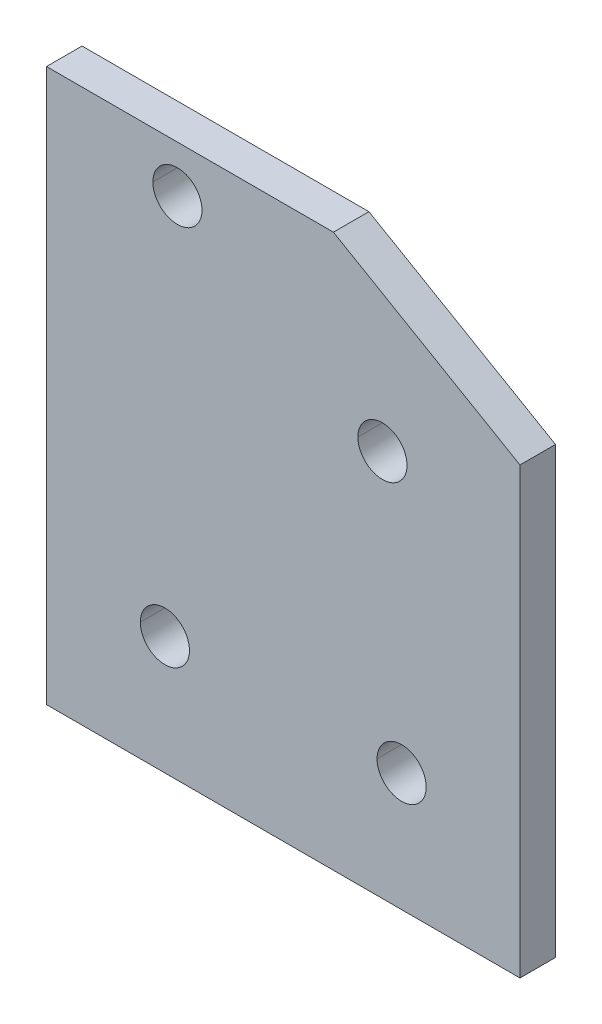
ISO-10303-21;
HEADER;
FILE_DESCRIPTION(('STEP AP214'),'2;1');
FILE_NAME('part.step','',(''),(''),'','','');
FILE_SCHEMA(('AUTOMOTIVE_DESIGN { 1 0 10303 214 1 1 1 1 }'));
ENDSEC;
DATA;
#1=APPLICATION_CONTEXT('core data for automotive mechanical design processes');
#2=APPLICATION_PROTOCOL_DEFINITION('international standard','automotive_design',2000,#1);
#3=PRODUCT_CONTEXT('',#1,'mechanical');
#4=PRODUCT('Part','Part','',(#3));
#5=PRODUCT_RELATED_PRODUCT_CATEGORY('part','',(#4));
#6=PRODUCT_DEFINITION_FORMATION('','',#4);
#7=PRODUCT_DEFINITION_CONTEXT('part definition',#1,'design');
#8=PRODUCT_DEFINITION('design','',#6,#7);
#9=PRODUCT_DEFINITION_SHAPE('','',#8);
#10=(LENGTH_UNIT() NAMED_UNIT(*) SI_UNIT(.MILLI.,.METRE.));
#11=(NAMED_UNIT(*) PLANE_ANGLE_UNIT() SI_UNIT($,.RADIAN.));
#12=(NAMED_UNIT(*) SI_UNIT($,.STERADIAN.) SOLID_ANGLE_UNIT());
#13=UNCERTAINTY_MEASURE_WITH_UNIT(LENGTH_MEASURE(1.E-05),#10,'distance_accuracy_value','');
#14=(GEOMETRIC_REPRESENTATION_CONTEXT(3) GLOBAL_UNCERTAINTY_ASSIGNED_CONTEXT((#13)) GLOBAL_UNIT_ASSIGNED_CONTEXT((#10,
#11,#12)) REPRESENTATION_CONTEXT('',''));
#15=CARTESIAN_POINT('',(0.,0.,0.));
#16=DIRECTION('',(0.,0.,1.));
#17=DIRECTION('',(1.,0.,0.));
#18=AXIS2_PLACEMENT_3D('',#15,#16,#17);
#19=CARTESIAN_POINT('',(-40.,46.685,-3.));
#20=DIRECTION('',(0.,-1.,0.));
#21=DIRECTION('',(0.,0.,1.));
#22=AXIS2_PLACEMENT_3D('',#19,#20,#21);
#23=PLANE('',#22);
#24=DIRECTION('',(1.,0.,0.));
#25=VECTOR('',#24,1.);
#26=CARTESIAN_POINT('',(-40.,46.685,3.));
#27=LINE('',#26,#25);
#28=CARTESIAN_POINT('',(-40.,46.685,3.));
#29=VERTEX_POINT('',#28);
#30=CARTESIAN_POINT('',(8.47999999999999,46.685,3.));
#31=VERTEX_POINT('',#30);
#32=EDGE_CURVE('E11',#29,#31,#27,.T.);
#33=ORIENTED_EDGE('',*,*,#32,.T.);
#34=DIRECTION('',(0.,0.,1.));
#35=VECTOR('',#34,1.);
#36=CARTESIAN_POINT('',(8.47999999999999,46.685,-3.));
#37=LINE('',#36,#35);
#38=CARTESIAN_POINT('',(8.47999999999999,46.685,-3.));
#39=VERTEX_POINT('',#38);
#40=EDGE_CURVE('E24',#39,#31,#37,.T.);
#41=ORIENTED_EDGE('',*,*,#40,.F.);
#42=DIRECTION('',(1.,0.,0.));
#43=VECTOR('',#42,1.);
#44=CARTESIAN_POINT('',(-40.,46.685,-3.));
#45=LINE('',#44,#43);
#46=CARTESIAN_POINT('',(-40.,46.685,-3.));
#47=VERTEX_POINT('',#46);
#48=EDGE_CURVE('E308',#47,#39,#45,.T.);
#49=ORIENTED_EDGE('',*,*,#48,.F.);
#50=DIRECTION('',(0.,0.,1.));
#51=VECTOR('',#50,1.);
#52=CARTESIAN_POINT('',(-40.,46.685,-3.));
#53=LINE('',#52,#51);
#54=EDGE_CURVE('E304',#47,#29,#53,.T.);
#55=ORIENTED_EDGE('',*,*,#54,.T.);
#56=EDGE_LOOP('',(#33,#41,#49,#55));
#57=FACE_BOUND('',#56,.T.);
#58=ADVANCED_FACE('F16',(#57),#23,.F.);
#59=CARTESIAN_POINT('',(-40.,-46.685,-3.));
#60=DIRECTION('',(1.,0.,0.));
#61=DIRECTION('',(0.,0.,-1.));
#62=AXIS2_PLACEMENT_3D('',#59,#60,#61);
#63=PLANE('',#62);
#64=DIRECTION('',(0.,1.,0.));
#65=VECTOR('',#64,1.);
#66=CARTESIAN_POINT('',(-40.,-46.685,3.));
#67=LINE('',#66,#65);
#68=CARTESIAN_POINT('',(-40.,-46.685,3.));
#69=VERTEX_POINT('',#68);
#70=EDGE_CURVE('E299',#69,#29,#67,.T.);
#71=ORIENTED_EDGE('',*,*,#70,.T.);
#72=ORIENTED_EDGE('',*,*,#54,.F.);
#73=DIRECTION('',(0.,1.,0.));
#74=VECTOR('',#73,1.);
#75=CARTESIAN_POINT('',(-40.,-46.685,-3.));
#76=LINE('',#75,#74);
#77=CARTESIAN_POINT('',(-40.,-46.685,-3.));
#78=VERTEX_POINT('',#77);
#79=EDGE_CURVE('E294',#78,#47,#76,.T.);
#80=ORIENTED_EDGE('',*,*,#79,.F.);
#81=DIRECTION('',(0.,0.,1.));
#82=VECTOR('',#81,1.);
#83=CARTESIAN_POINT('',(-40.,-46.685,-3.));
#84=LINE('',#83,#82);
#85=EDGE_CURVE('E290',#78,#69,#84,.T.);
#86=ORIENTED_EDGE('',*,*,#85,.T.);
#87=EDGE_LOOP('',(#71,#72,#80,#86));
#88=FACE_BOUND('',#87,.T.);
#89=ADVANCED_FACE('F332',(#88),#63,.F.);
#90=CARTESIAN_POINT('',(40.,-46.685,-3.));
#91=DIRECTION('',(0.,1.,0.));
#92=DIRECTION('',(0.,0.,-1.));
#93=AXIS2_PLACEMENT_3D('',#90,#91,#92);
#94=PLANE('',#93);
#95=DIRECTION('',(-1.,0.,0.));
#96=VECTOR('',#95,1.);
#97=CARTESIAN_POINT('',(40.,-46.685,3.));
#98=LINE('',#97,#96);
#99=CARTESIAN_POINT('',(40.,-46.685,3.));
#100=VERTEX_POINT('',#99);
#101=EDGE_CURVE('E285',#100,#69,#98,.T.);
#102=ORIENTED_EDGE('',*,*,#101,.T.);
#103=ORIENTED_EDGE('',*,*,#85,.F.);
#104=DIRECTION('',(-1.,0.,0.));
#105=VECTOR('',#104,1.);
#106=CARTESIAN_POINT('',(40.,-46.685,-3.));
#107=LINE('',#106,#105);
#108=CARTESIAN_POINT('',(40.,-46.685,-3.));
#109=VERTEX_POINT('',#108);
#110=EDGE_CURVE('E280',#109,#78,#107,.T.);
#111=ORIENTED_EDGE('',*,*,#110,.F.);
#112=DIRECTION('',(0.,0.,1.));
#113=VECTOR('',#112,1.);
#114=CARTESIAN_POINT('',(40.,-46.685,-3.));
#115=LINE('',#114,#113);
#116=EDGE_CURVE('E276',#109,#100,#115,.T.);
#117=ORIENTED_EDGE('',*,*,#116,.T.);
#118=EDGE_LOOP('',(#102,#103,#111,#117));
#119=FACE_BOUND('',#118,.T.);
#120=ADVANCED_FACE('F335',(#119),#94,.F.);
#121=CARTESIAN_POINT('',(40.,28.385,-3.));
#122=DIRECTION('',(-1.,0.,0.));
#123=DIRECTION('',(0.,0.,1.));
#124=AXIS2_PLACEMENT_3D('',#121,#122,#123);
#125=PLANE('',#124);
#126=DIRECTION('',(0.,-1.,0.));
#127=VECTOR('',#126,1.);
#128=CARTESIAN_POINT('',(40.,28.385,3.));
#129=LINE('',#128,#127);
#130=CARTESIAN_POINT('',(40.,28.385,3.));
#131=VERTEX_POINT('',#130);
#132=EDGE_CURVE('E271',#131,#100,#129,.T.);
#133=ORIENTED_EDGE('',*,*,#132,.T.);
#134=ORIENTED_EDGE('',*,*,#116,.F.);
#135=DIRECTION('',(0.,-1.,0.));
#136=VECTOR('',#135,1.);
#137=CARTESIAN_POINT('',(40.,28.385,-3.));
#138=LINE('',#137,#136);
#139=CARTESIAN_POINT('',(40.,28.385,-3.));
#140=VERTEX_POINT('',#139);
#141=EDGE_CURVE('E266',#140,#109,#138,.T.);
#142=ORIENTED_EDGE('',*,*,#141,.F.);
#143=DIRECTION('',(0.,0.,1.));
#144=VECTOR('',#143,1.);
#145=CARTESIAN_POINT('',(40.,28.385,-3.));
#146=LINE('',#145,#144);
#147=EDGE_CURVE('E262',#140,#131,#146,.T.);
#148=ORIENTED_EDGE('',*,*,#147,.T.);
#149=EDGE_LOOP('',(#133,#134,#142,#148));
#150=FACE_BOUND('',#149,.T.);
#151=ADVANCED_FACE('F327',(#150),#125,.F.);
#152=CARTESIAN_POINT('',(8.47999999999999,46.685,-3.));
#153=DIRECTION('',(-0.502095802702812,-0.864812005529652,0.));
#154=DIRECTION('',(-0.864812005529652,0.502095802702812,0.));
#155=AXIS2_PLACEMENT_3D('',#152,#153,#154);
#156=PLANE('',#155);
#157=DIRECTION('',(0.864812005529652,-0.502095802702812,0.));
#158=VECTOR('',#157,1.);
#159=CARTESIAN_POINT('',(8.47999999999999,46.685,3.));
#160=LINE('',#159,#158);
#161=EDGE_CURVE('E257',#31,#131,#160,.T.);
#162=ORIENTED_EDGE('',*,*,#161,.T.);
#163=ORIENTED_EDGE('',*,*,#147,.F.);
#164=DIRECTION('',(0.864812005529652,-0.502095802702812,0.));
#165=VECTOR('',#164,1.);
#166=CARTESIAN_POINT('',(8.47999999999999,46.685,-3.));
#167=LINE('',#166,#165);
#168=EDGE_CURVE('E252',#39,#140,#167,.T.);
#169=ORIENTED_EDGE('',*,*,#168,.F.);
#170=ORIENTED_EDGE('',*,*,#40,.T.);
#171=EDGE_LOOP('',(#162,#163,#169,#170));
#172=FACE_BOUND('',#171,.T.);
#173=ADVANCED_FACE('F319',(#172),#156,.F.);
#174=CARTESIAN_POINT('',(0.,-46.685,-3.));
#175=DIRECTION('',(0.,0.,-1.));
#176=DIRECTION('',(-1.,0.,0.));
#177=AXIS2_PLACEMENT_3D('',#174,#175,#176);
#178=PLANE('',#177);
#179=CARTESIAN_POINT('',(20.,-26.685,-3.));
#180=DIRECTION('',(0.,0.,-1.));
#181=DIRECTION('',(-1.,0.,0.));
#182=AXIS2_PLACEMENT_3D('',#179,#180,#181);
#183=CIRCLE('',#182,4.15);
#184=CARTESIAN_POINT('',(15.85,-26.685,-3.));
#185=VERTEX_POINT('',#184);
#186=CARTESIAN_POINT('',(24.15,-26.685,-3.));
#187=VERTEX_POINT('',#186);
#188=EDGE_CURVE('E247',#185,#187,#183,.T.);
#189=ORIENTED_EDGE('',*,*,#188,.F.);
#190=CARTESIAN_POINT('',(20.,-26.685,-3.));
#191=DIRECTION('',(0.,0.,-1.));
#192=DIRECTION('',(-1.,0.,0.));
#193=AXIS2_PLACEMENT_3D('',#190,#191,#192);
#194=CIRCLE('',#193,4.15);
#195=EDGE_CURVE('E242',#187,#185,#194,.T.);
#196=ORIENTED_EDGE('',*,*,#195,.F.);
#197=EDGE_LOOP('',(#189,#196));
#198=FACE_BOUND('',#197,.T.);
#199=CARTESIAN_POINT('',(16.76,18.785,-3.));
#200=DIRECTION('',(0.,0.,-1.));
#201=DIRECTION('',(-1.,0.,0.));
#202=AXIS2_PLACEMENT_3D('',#199,#200,#201);
#203=CIRCLE('',#202,4.15);
#204=CARTESIAN_POINT('',(12.61,18.785,-3.));
#205=VERTEX_POINT('',#204);
#206=CARTESIAN_POINT('',(20.91,18.785,-3.));
#207=VERTEX_POINT('',#206);
#208=EDGE_CURVE('E237',#205,#207,#203,.T.);
#209=ORIENTED_EDGE('',*,*,#208,.F.);
#210=CARTESIAN_POINT('',(16.76,18.785,-3.));
#211=DIRECTION('',(0.,0.,-1.));
#212=DIRECTION('',(-1.,0.,0.));
#213=AXIS2_PLACEMENT_3D('',#210,#211,#212);
#214=CIRCLE('',#213,4.15);
#215=EDGE_CURVE('E232',#207,#205,#214,.T.);
#216=ORIENTED_EDGE('',*,*,#215,.F.);
#217=EDGE_LOOP('',(#209,#216));
#218=FACE_BOUND('',#217,.T.);
#219=CARTESIAN_POINT('',(-17.88,38.784413324729,-3.));
#220=DIRECTION('',(0.,0.,-1.));
#221=DIRECTION('',(-1.,0.,0.));
#222=AXIS2_PLACEMENT_3D('',#219,#220,#221);
#223=CIRCLE('',#222,4.15);
#224=CARTESIAN_POINT('',(-22.03,38.784413324729,-3.));
#225=VERTEX_POINT('',#224);
#226=CARTESIAN_POINT('',(-13.73,38.784413324729,-3.));
#227=VERTEX_POINT('',#226);
#228=EDGE_CURVE('E228',#225,#227,#223,.T.);
#229=ORIENTED_EDGE('',*,*,#228,.F.);
#230=CARTESIAN_POINT('',(-17.88,38.784413324729,-3.));
#231=DIRECTION('',(0.,0.,-1.));
#232=DIRECTION('',(-1.,0.,0.));
#233=AXIS2_PLACEMENT_3D('',#230,#231,#232);
#234=CIRCLE('',#233,4.15);
#235=EDGE_CURVE('E121',#227,#225,#234,.T.);
#236=ORIENTED_EDGE('',*,*,#235,.F.);
#237=EDGE_LOOP('',(#229,#236));
#238=FACE_BOUND('',#237,.T.);
#239=CARTESIAN_POINT('',(-20.,-26.685,-3.));
#240=DIRECTION('',(0.,0.,-1.));
#241=DIRECTION('',(-1.,0.,0.));
#242=AXIS2_PLACEMENT_3D('',#239,#240,#241);
#243=CIRCLE('',#242,4.15);
#244=CARTESIAN_POINT('',(-24.15,-26.685,-3.));
#245=VERTEX_POINT('',#244);
#246=CARTESIAN_POINT('',(-15.85,-26.685,-3.));
#247=VERTEX_POINT('',#246);
#248=EDGE_CURVE('E221',#245,#247,#243,.T.);
#249=ORIENTED_EDGE('',*,*,#248,.F.);
#250=CARTESIAN_POINT('',(-20.,-26.685,-3.));
#251=DIRECTION('',(0.,0.,-1.));
#252=DIRECTION('',(-1.,0.,0.));
#253=AXIS2_PLACEMENT_3D('',#250,#251,#252);
#254=CIRCLE('',#253,4.15);
#255=EDGE_CURVE('E217',#247,#245,#254,.T.);
#256=ORIENTED_EDGE('',*,*,#255,.F.);
#257=EDGE_LOOP('',(#249,#256));
#258=FACE_BOUND('',#257,.T.);
#259=ORIENTED_EDGE('',*,*,#168,.T.);
#260=ORIENTED_EDGE('',*,*,#141,.T.);
#261=ORIENTED_EDGE('',*,*,#110,.T.);
#262=ORIENTED_EDGE('',*,*,#79,.T.);
#263=ORIENTED_EDGE('',*,*,#48,.T.);
#264=EDGE_LOOP('',(#259,#260,#261,#262,#263));
#265=FACE_BOUND('',#264,.T.);
#266=ADVANCED_FACE('F329',(#198,#218,#238,#258,#265),#178,.T.);
#267=CARTESIAN_POINT('',(-20.,-26.685,-3.));
#268=DIRECTION('',(0.,0.,-1.));
#269=DIRECTION('',(0.,1.,0.));
#270=AXIS2_PLACEMENT_3D('',#267,#268,#269);
#271=CYLINDRICAL_SURFACE('',#270,4.15);
#272=CARTESIAN_POINT('',(-20.,-26.685,3.));
#273=DIRECTION('',(0.,0.,-1.));
#274=DIRECTION('',(-1.,0.,0.));
#275=AXIS2_PLACEMENT_3D('',#272,#273,#274);
#276=CIRCLE('',#275,4.15);
#277=CARTESIAN_POINT('',(-15.85,-26.685,3.));
#278=VERTEX_POINT('',#277);
#279=CARTESIAN_POINT('',(-24.15,-26.685,3.));
#280=VERTEX_POINT('',#279);
#281=EDGE_CURVE('E214',#278,#280,#276,.T.);
#282=ORIENTED_EDGE('',*,*,#281,.F.);
#283=CARTESIAN_POINT('',(-15.85,-26.685,3.));
#284=DIRECTION('',(0.,0.,-1.));
#285=VECTOR('',#284,1.);
#286=LINE('',#283,#285);
#287=EDGE_CURVE('E191',#278,#247,#286,.T.);
#288=ORIENTED_EDGE('',*,*,#287,.T.);
#289=ORIENTED_EDGE('',*,*,#255,.T.);
#290=CARTESIAN_POINT('',(-24.15,-26.685,3.));
#291=DIRECTION('',(0.,0.,-1.));
#292=VECTOR('',#291,1.);
#293=LINE('',#290,#292);
#294=EDGE_CURVE('E204',#280,#245,#293,.T.);
#295=ORIENTED_EDGE('',*,*,#294,.F.);
#296=EDGE_LOOP('',(#282,#288,#289,#295));
#297=FACE_BOUND('',#296,.T.);
#298=ADVANCED_FACE('F169',(#297),#271,.F.);
#299=CARTESIAN_POINT('',(-20.,-26.685,-3.));
#300=DIRECTION('',(0.,0.,-1.));
#301=DIRECTION('',(0.,-1.,0.));
#302=AXIS2_PLACEMENT_3D('',#299,#300,#301);
#303=CYLINDRICAL_SURFACE('',#302,4.15);
#304=ORIENTED_EDGE('',*,*,#248,.T.);
#305=ORIENTED_EDGE('',*,*,#287,.F.);
#306=CARTESIAN_POINT('',(-20.,-26.685,3.));
#307=DIRECTION('',(0.,0.,-1.));
#308=DIRECTION('',(-1.,0.,0.));
#309=AXIS2_PLACEMENT_3D('',#306,#307,#308);
#310=CIRCLE('',#309,4.15);
#311=EDGE_CURVE('E150',#280,#278,#310,.T.);
#312=ORIENTED_EDGE('',*,*,#311,.F.);
#313=ORIENTED_EDGE('',*,*,#294,.T.);
#314=EDGE_LOOP('',(#304,#305,#312,#313));
#315=FACE_BOUND('',#314,.T.);
#316=ADVANCED_FACE('F159',(#315),#303,.F.);
#317=CARTESIAN_POINT('',(0.,-46.685,3.));
#318=DIRECTION('',(0.,0.,-1.));
#319=DIRECTION('',(-1.,0.,0.));
#320=AXIS2_PLACEMENT_3D('',#317,#318,#319);
#321=PLANE('',#320);
#322=CARTESIAN_POINT('',(20.,-26.685,3.));
#323=DIRECTION('',(0.,0.,-1.));
#324=DIRECTION('',(-1.,0.,0.));
#325=AXIS2_PLACEMENT_3D('',#322,#323,#324);
#326=CIRCLE('',#325,4.15);
#327=CARTESIAN_POINT('',(15.85,-26.685,3.));
#328=VERTEX_POINT('',#327);
#329=CARTESIAN_POINT('',(24.15,-26.685,3.));
#330=VERTEX_POINT('',#329);
#331=EDGE_CURVE('E146',#328,#330,#326,.T.);
#332=ORIENTED_EDGE('',*,*,#331,.T.);
#333=CARTESIAN_POINT('',(20.,-26.685,3.));
#334=DIRECTION('',(0.,0.,-1.));
#335=DIRECTION('',(-1.,0.,0.));
#336=AXIS2_PLACEMENT_3D('',#333,#334,#335);
#337=CIRCLE('',#336,4.15);
#338=EDGE_CURVE('E142',#330,#328,#337,.T.);
#339=ORIENTED_EDGE('',*,*,#338,.T.);
#340=EDGE_LOOP('',(#332,#339));
#341=FACE_BOUND('',#340,.T.);
#342=CARTESIAN_POINT('',(16.76,18.785,3.));
#343=DIRECTION('',(0.,0.,-1.));
#344=DIRECTION('',(-1.,0.,0.));
#345=AXIS2_PLACEMENT_3D('',#342,#343,#344);
#346=CIRCLE('',#345,4.15);
#347=CARTESIAN_POINT('',(12.61,18.785,3.));
#348=VERTEX_POINT('',#347);
#349=CARTESIAN_POINT('',(20.91,18.785,3.));
#350=VERTEX_POINT('',#349);
#351=EDGE_CURVE('E132',#348,#350,#346,.T.);
#352=ORIENTED_EDGE('',*,*,#351,.T.);
#353=CARTESIAN_POINT('',(16.76,18.785,3.));
#354=DIRECTION('',(0.,0.,-1.));
#355=DIRECTION('',(-1.,0.,0.));
#356=AXIS2_PLACEMENT_3D('',#353,#354,#355);
#357=CIRCLE('',#356,4.15);
#358=EDGE_CURVE('E130',#350,#348,#357,.T.);
#359=ORIENTED_EDGE('',*,*,#358,.T.);
#360=EDGE_LOOP('',(#352,#359));
#361=FACE_BOUND('',#360,.T.);
#362=CARTESIAN_POINT('',(-17.88,38.784413324729,3.));
#363=DIRECTION('',(0.,0.,-1.));
#364=DIRECTION('',(-1.,0.,0.));
#365=AXIS2_PLACEMENT_3D('',#362,#363,#364);
#366=CIRCLE('',#365,4.15);
#367=CARTESIAN_POINT('',(-22.03,38.784413324729,3.));
#368=VERTEX_POINT('',#367);
#369=CARTESIAN_POINT('',(-13.73,38.784413324729,3.));
#370=VERTEX_POINT('',#369);
#371=EDGE_CURVE('E110',#368,#370,#366,.T.);
#372=ORIENTED_EDGE('',*,*,#371,.T.);
#373=CARTESIAN_POINT('',(-17.88,38.784413324729,3.));
#374=DIRECTION('',(0.,0.,-1.));
#375=DIRECTION('',(-1.,0.,0.));
#376=AXIS2_PLACEMENT_3D('',#373,#374,#375);
#377=CIRCLE('',#376,4.15);
#378=EDGE_CURVE('E105',#370,#368,#377,.T.);
#379=ORIENTED_EDGE('',*,*,#378,.T.);
#380=EDGE_LOOP('',(#372,#379));
#381=FACE_BOUND('',#380,.T.);
#382=ORIENTED_EDGE('',*,*,#311,.T.);
#383=ORIENTED_EDGE('',*,*,#281,.T.);
#384=EDGE_LOOP('',(#382,#383));
#385=FACE_BOUND('',#384,.T.);
#386=ORIENTED_EDGE('',*,*,#161,.F.);
#387=ORIENTED_EDGE('',*,*,#32,.F.);
#388=ORIENTED_EDGE('',*,*,#70,.F.);
#389=ORIENTED_EDGE('',*,*,#101,.F.);
#390=ORIENTED_EDGE('',*,*,#132,.F.);
#391=EDGE_LOOP('',(#386,#387,#388,#389,#390));
#392=FACE_BOUND('',#391,.T.);
#393=ADVANCED_FACE('F107',(#341,#361,#381,#385,#392),#321,.F.);
#394=CARTESIAN_POINT('',(-17.88,38.784413324729,-3.));
#395=DIRECTION('',(0.,0.,-1.));
#396=DIRECTION('',(0.,1.,0.));
#397=AXIS2_PLACEMENT_3D('',#394,#395,#396);
#398=CYLINDRICAL_SURFACE('',#397,4.15);
#399=ORIENTED_EDGE('',*,*,#378,.F.);
#400=CARTESIAN_POINT('',(-13.73,38.784413324729,3.));
#401=DIRECTION('',(0.,0.,-1.));
#402=VECTOR('',#401,1.);
#403=LINE('',#400,#402);
#404=EDGE_CURVE('E114',#370,#227,#403,.T.);
#405=ORIENTED_EDGE('',*,*,#404,.T.);
#406=ORIENTED_EDGE('',*,*,#235,.T.);
#407=CARTESIAN_POINT('',(-22.03,38.784413324729,3.));
#408=DIRECTION('',(0.,0.,-1.));
#409=VECTOR('',#408,1.);
#410=LINE('',#407,#409);
#411=EDGE_CURVE('E118',#368,#225,#410,.T.);
#412=ORIENTED_EDGE('',*,*,#411,.F.);
#413=EDGE_LOOP('',(#399,#405,#406,#412));
#414=FACE_BOUND('',#413,.T.);
#415=ADVANCED_FACE('F120',(#414),#398,.F.);
#416=CARTESIAN_POINT('',(-17.88,38.784413324729,-3.));
#417=DIRECTION('',(0.,0.,-1.));
#418=DIRECTION('',(0.,-1.,0.));
#419=AXIS2_PLACEMENT_3D('',#416,#417,#418);
#420=CYLINDRICAL_SURFACE('',#419,4.15);
#421=ORIENTED_EDGE('',*,*,#228,.T.);
#422=ORIENTED_EDGE('',*,*,#404,.F.);
#423=ORIENTED_EDGE('',*,*,#371,.F.);
#424=ORIENTED_EDGE('',*,*,#411,.T.);
#425=EDGE_LOOP('',(#421,#422,#423,#424));
#426=FACE_BOUND('',#425,.T.);
#427=ADVANCED_FACE('F128',(#426),#420,.F.);
#428=CARTESIAN_POINT('',(16.76,18.785,-3.));
#429=DIRECTION('',(0.,0.,-1.));
#430=DIRECTION('',(0.,1.,0.));
#431=AXIS2_PLACEMENT_3D('',#428,#429,#430);
#432=CYLINDRICAL_SURFACE('',#431,4.15);
#433=ORIENTED_EDGE('',*,*,#358,.F.);
#434=CARTESIAN_POINT('',(20.91,18.785,3.));
#435=DIRECTION('',(0.,0.,-1.));
#436=VECTOR('',#435,1.);
#437=LINE('',#434,#436);
#438=EDGE_CURVE('E125',#350,#207,#437,.T.);
#439=ORIENTED_EDGE('',*,*,#438,.T.);
#440=ORIENTED_EDGE('',*,*,#215,.T.);
#441=CARTESIAN_POINT('',(12.61,18.785,3.));
#442=DIRECTION('',(0.,0.,-1.));
#443=VECTOR('',#442,1.);
#444=LINE('',#441,#443);
#445=EDGE_CURVE('E614',#348,#205,#444,.T.);
#446=ORIENTED_EDGE('',*,*,#445,.F.);
#447=EDGE_LOOP('',(#433,#439,#440,#446));
#448=FACE_BOUND('',#447,.T.);
#449=ADVANCED_FACE('F439',(#448),#432,.F.);
#450=CARTESIAN_POINT('',(16.76,18.785,-3.));
#451=DIRECTION('',(0.,0.,-1.));
#452=DIRECTION('',(0.,-1.,0.));
#453=AXIS2_PLACEMENT_3D('',#450,#451,#452);
#454=CYLINDRICAL_SURFACE('',#453,4.15);
#455=ORIENTED_EDGE('',*,*,#208,.T.);
#456=ORIENTED_EDGE('',*,*,#438,.F.);
#457=ORIENTED_EDGE('',*,*,#351,.F.);
#458=ORIENTED_EDGE('',*,*,#445,.T.);
#459=EDGE_LOOP('',(#455,#456,#457,#458));
#460=FACE_BOUND('',#459,.T.);
#461=ADVANCED_FACE('F450',(#460),#454,.F.);
#462=CARTESIAN_POINT('',(20.,-26.685,-3.));
#463=DIRECTION('',(0.,0.,-1.));
#464=DIRECTION('',(0.,1.,0.));
#465=AXIS2_PLACEMENT_3D('',#462,#463,#464);
#466=CYLINDRICAL_SURFACE('',#465,4.15);
#467=ORIENTED_EDGE('',*,*,#338,.F.);
#468=CARTESIAN_POINT('',(24.15,-26.685,3.));
#469=DIRECTION('',(0.,0.,-1.));
#470=VECTOR('',#469,1.);
#471=LINE('',#468,#470);
#472=EDGE_CURVE('E612',#330,#187,#471,.T.);
#473=ORIENTED_EDGE('',*,*,#472,.T.);
#474=ORIENTED_EDGE('',*,*,#195,.T.);
#475=CARTESIAN_POINT('',(15.85,-26.685,3.));
#476=DIRECTION('',(0.,0.,-1.));
#477=VECTOR('',#476,1.);
#478=LINE('',#475,#477);
#479=EDGE_CURVE('E608',#328,#185,#478,.T.);
#480=ORIENTED_EDGE('',*,*,#479,.F.);
#481=EDGE_LOOP('',(#467,#473,#474,#480));
#482=FACE_BOUND('',#481,.T.);
#483=ADVANCED_FACE('F462',(#482),#466,.F.);
#484=CARTESIAN_POINT('',(20.,-26.685,-3.));
#485=DIRECTION('',(0.,0.,-1.));
#486=DIRECTION('',(0.,-1.,0.));
#487=AXIS2_PLACEMENT_3D('',#484,#485,#486);
#488=CYLINDRICAL_SURFACE('',#487,4.15);
#489=ORIENTED_EDGE('',*,*,#188,.T.);
#490=ORIENTED_EDGE('',*,*,#472,.F.);
#491=ORIENTED_EDGE('',*,*,#331,.F.);
#492=ORIENTED_EDGE('',*,*,#479,.T.);
#493=EDGE_LOOP('',(#489,#490,#491,#492));
#494=FACE_BOUND('',#493,.T.);
#495=ADVANCED_FACE('F474',(#494),#488,.F.);
#496=CLOSED_SHELL('',(#58,#89,#120,#151,#173,#266,#298,#316,#393,#415,#427,#449,#461,#483,#495));
#497=MANIFOLD_SOLID_BREP('B1',#496);
#498=ADVANCED_BREP_SHAPE_REPRESENTATION('',(#18,#497),#14);
#499=SHAPE_DEFINITION_REPRESENTATION(#9,#498);
ENDSEC;
END-ISO-10303-21;
